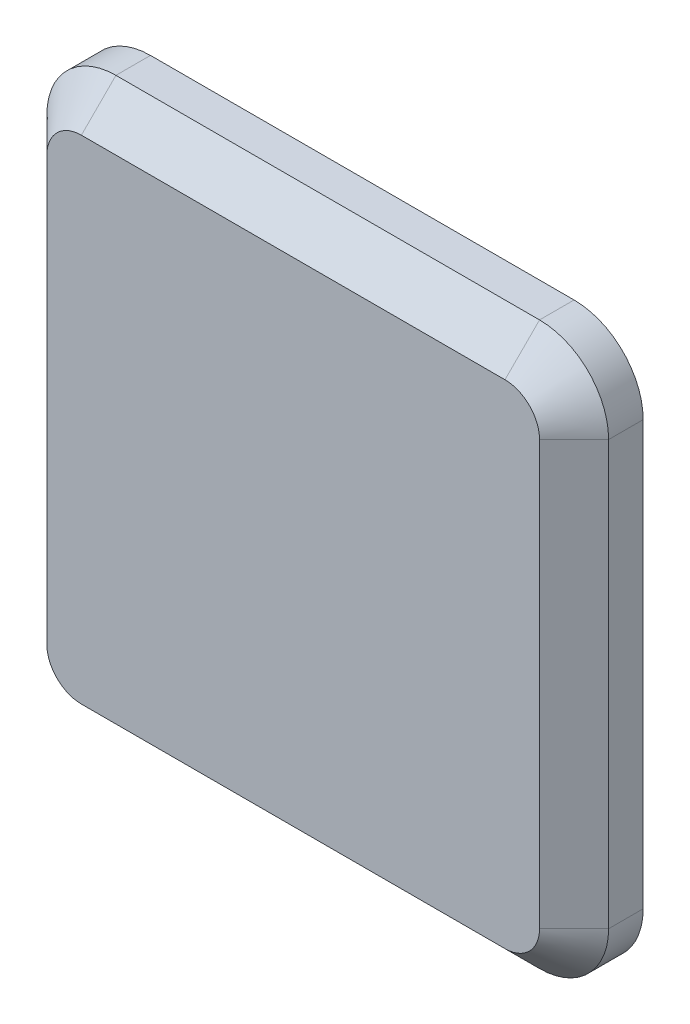
ISO-10303-21;
HEADER;
FILE_DESCRIPTION(('STEP AP214'),'2;1');
FILE_NAME('part.step','',(''),(''),'','','');
FILE_SCHEMA(('AUTOMOTIVE_DESIGN { 1 0 10303 214 1 1 1 1 }'));
ENDSEC;
DATA;
#1=APPLICATION_CONTEXT('core data for automotive mechanical design processes');
#2=APPLICATION_PROTOCOL_DEFINITION('international standard','automotive_design',2000,#1);
#3=PRODUCT_CONTEXT('',#1,'mechanical');
#4=PRODUCT('Part','Part','',(#3));
#5=PRODUCT_RELATED_PRODUCT_CATEGORY('part','',(#4));
#6=PRODUCT_DEFINITION_FORMATION('','',#4);
#7=PRODUCT_DEFINITION_CONTEXT('part definition',#1,'design');
#8=PRODUCT_DEFINITION('design','',#6,#7);
#9=PRODUCT_DEFINITION_SHAPE('','',#8);
#10=(LENGTH_UNIT() NAMED_UNIT(*) SI_UNIT(.MILLI.,.METRE.));
#11=(NAMED_UNIT(*) PLANE_ANGLE_UNIT() SI_UNIT($,.RADIAN.));
#12=(NAMED_UNIT(*) SI_UNIT($,.STERADIAN.) SOLID_ANGLE_UNIT());
#13=UNCERTAINTY_MEASURE_WITH_UNIT(LENGTH_MEASURE(1.E-05),#10,'distance_accuracy_value','');
#14=(GEOMETRIC_REPRESENTATION_CONTEXT(3) GLOBAL_UNCERTAINTY_ASSIGNED_CONTEXT((#13)) GLOBAL_UNIT_ASSIGNED_CONTEXT((#10,
#11,#12)) REPRESENTATION_CONTEXT('',''));
#15=CARTESIAN_POINT('',(0.,0.,0.));
#16=DIRECTION('',(0.,0.,1.));
#17=DIRECTION('',(1.,0.,0.));
#18=AXIS2_PLACEMENT_3D('',#15,#16,#17);
#19=CARTESIAN_POINT('',(-16.2634559672906,-16.2634559672906,4.));
#20=DIRECTION('',(1.,0.,0.));
#21=DIRECTION('',(0.,0.,-1.));
#22=AXIS2_PLACEMENT_3D('',#19,#20,#21);
#23=PLANE('',#22);
#24=DIRECTION('',(0.,0.,-1.));
#25=VECTOR('',#24,1.);
#26=CARTESIAN_POINT('',(-16.2634559672906,-12.2634559672906,4.));
#27=LINE('',#26,#25);
#28=CARTESIAN_POINT('',(-16.2634559672906,-12.2634559672906,0.));
#29=VERTEX_POINT('',#28);
#30=CARTESIAN_POINT('',(-16.2634559672906,-12.2634559672906,2.));
#31=VERTEX_POINT('',#30);
#32=EDGE_CURVE('E147',#29,#31,#27,.F.);
#33=ORIENTED_EDGE('',*,*,#32,.T.);
#34=DIRECTION('',(0.,1.,0.));
#35=VECTOR('',#34,1.);
#36=CARTESIAN_POINT('',(-16.2634559672906,12.2634559672906,2.));
#37=LINE('',#36,#35);
#38=CARTESIAN_POINT('',(-16.2634559672906,12.2634559672906,2.));
#39=VERTEX_POINT('',#38);
#40=EDGE_CURVE('E207',#31,#39,#37,.T.);
#41=ORIENTED_EDGE('',*,*,#40,.T.);
#42=DIRECTION('',(0.,0.,-1.));
#43=VECTOR('',#42,1.);
#44=CARTESIAN_POINT('',(-16.2634559672906,12.2634559672906,4.));
#45=LINE('',#44,#43);
#46=CARTESIAN_POINT('',(-16.2634559672906,12.2634559672906,0.));
#47=VERTEX_POINT('',#46);
#48=EDGE_CURVE('E151',#39,#47,#45,.T.);
#49=ORIENTED_EDGE('',*,*,#48,.T.);
#50=DIRECTION('',(0.,-1.,0.));
#51=VECTOR('',#50,1.);
#52=CARTESIAN_POINT('',(-16.2634559672906,-16.2634559672906,0.));
#53=LINE('',#52,#51);
#54=EDGE_CURVE('E158',#47,#29,#53,.T.);
#55=ORIENTED_EDGE('',*,*,#54,.T.);
#56=EDGE_LOOP('',(#33,#41,#49,#55));
#57=FACE_BOUND('',#56,.T.);
#58=ADVANCED_FACE('F39',(#57),#23,.F.);
#59=CARTESIAN_POINT('',(16.2634559672906,-16.2634559672906,4.));
#60=DIRECTION('',(0.,1.,0.));
#61=DIRECTION('',(-1.,0.,0.));
#62=AXIS2_PLACEMENT_3D('',#59,#60,#61);
#63=PLANE('',#62);
#64=DIRECTION('',(0.,0.,-1.));
#65=VECTOR('',#64,1.);
#66=CARTESIAN_POINT('',(12.2634559672906,-16.2634559672906,4.));
#67=LINE('',#66,#65);
#68=CARTESIAN_POINT('',(12.2634559672906,-16.2634559672906,0.));
#69=VERTEX_POINT('',#68);
#70=CARTESIAN_POINT('',(12.2634559672906,-16.2634559672906,2.));
#71=VERTEX_POINT('',#70);
#72=EDGE_CURVE('E141',#69,#71,#67,.F.);
#73=ORIENTED_EDGE('',*,*,#72,.T.);
#74=DIRECTION('',(-1.,0.,0.));
#75=VECTOR('',#74,1.);
#76=CARTESIAN_POINT('',(-12.2634559672906,-16.2634559672906,2.));
#77=LINE('',#76,#75);
#78=CARTESIAN_POINT('',(-12.2634559672906,-16.2634559672906,2.));
#79=VERTEX_POINT('',#78);
#80=EDGE_CURVE('E138',#71,#79,#77,.T.);
#81=ORIENTED_EDGE('',*,*,#80,.T.);
#82=DIRECTION('',(0.,0.,-1.));
#83=VECTOR('',#82,1.);
#84=CARTESIAN_POINT('',(-12.2634559672906,-16.2634559672906,4.));
#85=LINE('',#84,#83);
#86=CARTESIAN_POINT('',(-12.2634559672906,-16.2634559672906,0.));
#87=VERTEX_POINT('',#86);
#88=EDGE_CURVE('E130',#79,#87,#85,.T.);
#89=ORIENTED_EDGE('',*,*,#88,.T.);
#90=DIRECTION('',(1.,0.,0.));
#91=VECTOR('',#90,1.);
#92=CARTESIAN_POINT('',(16.2634559672906,-16.2634559672906,0.));
#93=LINE('',#92,#91);
#94=EDGE_CURVE('E135',#87,#69,#93,.T.);
#95=ORIENTED_EDGE('',*,*,#94,.T.);
#96=EDGE_LOOP('',(#73,#81,#89,#95));
#97=FACE_BOUND('',#96,.T.);
#98=ADVANCED_FACE('F133',(#97),#63,.F.);
#99=CARTESIAN_POINT('',(16.2634559672906,-16.2634559672906,4.));
#100=DIRECTION('',(-1.,0.,0.));
#101=DIRECTION('',(0.,0.,1.));
#102=AXIS2_PLACEMENT_3D('',#99,#100,#101);
#103=PLANE('',#102);
#104=DIRECTION('',(0.,0.,-1.));
#105=VECTOR('',#104,1.);
#106=CARTESIAN_POINT('',(16.2634559672906,12.2634559672906,4.));
#107=LINE('',#106,#105);
#108=CARTESIAN_POINT('',(16.2634559672906,12.2634559672906,0.));
#109=VERTEX_POINT('',#108);
#110=CARTESIAN_POINT('',(16.2634559672906,12.2634559672906,2.));
#111=VERTEX_POINT('',#110);
#112=EDGE_CURVE('E174',#109,#111,#107,.F.);
#113=ORIENTED_EDGE('',*,*,#112,.T.);
#114=DIRECTION('',(0.,-1.,0.));
#115=VECTOR('',#114,1.);
#116=CARTESIAN_POINT('',(16.2634559672906,-12.2634559672906,2.));
#117=LINE('',#116,#115);
#118=CARTESIAN_POINT('',(16.2634559672906,-12.2634559672906,2.));
#119=VERTEX_POINT('',#118);
#120=EDGE_CURVE('E205',#111,#119,#117,.T.);
#121=ORIENTED_EDGE('',*,*,#120,.T.);
#122=DIRECTION('',(0.,0.,-1.));
#123=VECTOR('',#122,1.);
#124=CARTESIAN_POINT('',(16.2634559672906,-12.2634559672906,4.));
#125=LINE('',#124,#123);
#126=CARTESIAN_POINT('',(16.2634559672906,-12.2634559672906,0.));
#127=VERTEX_POINT('',#126);
#128=EDGE_CURVE('E177',#119,#127,#125,.T.);
#129=ORIENTED_EDGE('',*,*,#128,.T.);
#130=DIRECTION('',(0.,1.,0.));
#131=VECTOR('',#130,1.);
#132=CARTESIAN_POINT('',(16.2634559672906,-16.2634559672906,0.));
#133=LINE('',#132,#131);
#134=EDGE_CURVE('E157',#127,#109,#133,.T.);
#135=ORIENTED_EDGE('',*,*,#134,.T.);
#136=EDGE_LOOP('',(#113,#121,#129,#135));
#137=FACE_BOUND('',#136,.T.);
#138=ADVANCED_FACE('F249',(#137),#103,.F.);
#139=CARTESIAN_POINT('',(16.2634559672906,16.2634559672906,4.));
#140=DIRECTION('',(0.,-1.,0.));
#141=DIRECTION('',(1.,0.,0.));
#142=AXIS2_PLACEMENT_3D('',#139,#140,#141);
#143=PLANE('',#142);
#144=DIRECTION('',(0.,0.,-1.));
#145=VECTOR('',#144,1.);
#146=CARTESIAN_POINT('',(-12.2634559672906,16.2634559672906,4.));
#147=LINE('',#146,#145);
#148=CARTESIAN_POINT('',(-12.2634559672906,16.2634559672906,0.));
#149=VERTEX_POINT('',#148);
#150=CARTESIAN_POINT('',(-12.2634559672906,16.2634559672906,2.));
#151=VERTEX_POINT('',#150);
#152=EDGE_CURVE('E179',#149,#151,#147,.F.);
#153=ORIENTED_EDGE('',*,*,#152,.T.);
#154=DIRECTION('',(1.,0.,0.));
#155=VECTOR('',#154,1.);
#156=CARTESIAN_POINT('',(12.2634559672906,16.2634559672906,2.));
#157=LINE('',#156,#155);
#158=CARTESIAN_POINT('',(12.2634559672906,16.2634559672906,2.));
#159=VERTEX_POINT('',#158);
#160=EDGE_CURVE('E11',#151,#159,#157,.T.);
#161=ORIENTED_EDGE('',*,*,#160,.T.);
#162=DIRECTION('',(0.,0.,-1.));
#163=VECTOR('',#162,1.);
#164=CARTESIAN_POINT('',(12.2634559672906,16.2634559672906,4.));
#165=LINE('',#164,#163);
#166=CARTESIAN_POINT('',(12.2634559672906,16.2634559672906,0.));
#167=VERTEX_POINT('',#166);
#168=EDGE_CURVE('E181',#159,#167,#165,.T.);
#169=ORIENTED_EDGE('',*,*,#168,.T.);
#170=DIRECTION('',(-1.,0.,0.));
#171=VECTOR('',#170,1.);
#172=CARTESIAN_POINT('',(16.2634559672906,16.2634559672906,0.));
#173=LINE('',#172,#171);
#174=EDGE_CURVE('E161',#167,#149,#173,.T.);
#175=ORIENTED_EDGE('',*,*,#174,.T.);
#176=EDGE_LOOP('',(#153,#161,#169,#175));
#177=FACE_BOUND('',#176,.T.);
#178=ADVANCED_FACE('F253',(#177),#143,.F.);
#179=CARTESIAN_POINT('',(0.,0.,4.));
#180=DIRECTION('',(0.,0.,1.));
#181=DIRECTION('',(1.,0.,0.));
#182=AXIS2_PLACEMENT_3D('',#179,#180,#181);
#183=PLANE('',#182);
#184=CARTESIAN_POINT('',(-12.2634559672906,-12.2634559672906,4.));
#185=DIRECTION('',(0.,0.,1.));
#186=DIRECTION('',(1.,0.,0.));
#187=AXIS2_PLACEMENT_3D('',#184,#185,#186);
#188=CIRCLE('',#187,2.00000000000001);
#189=CARTESIAN_POINT('',(-14.2634559672906,-12.2634559672906,4.));
#190=VERTEX_POINT('',#189);
#191=CARTESIAN_POINT('',(-12.2634559672906,-14.2634559672906,4.));
#192=VERTEX_POINT('',#191);
#193=EDGE_CURVE('E193',#190,#192,#188,.T.);
#194=ORIENTED_EDGE('',*,*,#193,.T.);
#195=DIRECTION('',(1.,0.,0.));
#196=VECTOR('',#195,1.);
#197=CARTESIAN_POINT('',(12.2634559672906,-14.2634559672906,4.));
#198=LINE('',#197,#196);
#199=CARTESIAN_POINT('',(12.2634559672906,-14.2634559672906,4.));
#200=VERTEX_POINT('',#199);
#201=EDGE_CURVE('E197',#192,#200,#198,.T.);
#202=ORIENTED_EDGE('',*,*,#201,.T.);
#203=CARTESIAN_POINT('',(12.2634559672906,-12.2634559672906,4.));
#204=DIRECTION('',(0.,0.,1.));
#205=DIRECTION('',(1.,0.,0.));
#206=AXIS2_PLACEMENT_3D('',#203,#204,#205);
#207=CIRCLE('',#206,2.00000000000001);
#208=CARTESIAN_POINT('',(14.2634559672906,-12.2634559672906,4.));
#209=VERTEX_POINT('',#208);
#210=EDGE_CURVE('E195',#200,#209,#207,.T.);
#211=ORIENTED_EDGE('',*,*,#210,.T.);
#212=DIRECTION('',(0.,1.,0.));
#213=VECTOR('',#212,1.);
#214=CARTESIAN_POINT('',(14.2634559672906,12.2634559672906,4.));
#215=LINE('',#214,#213);
#216=CARTESIAN_POINT('',(14.2634559672906,12.2634559672906,4.));
#217=VERTEX_POINT('',#216);
#218=EDGE_CURVE('E191',#209,#217,#215,.T.);
#219=ORIENTED_EDGE('',*,*,#218,.T.);
#220=CARTESIAN_POINT('',(12.2634559672906,12.2634559672906,4.));
#221=DIRECTION('',(0.,0.,1.));
#222=DIRECTION('',(1.,0.,0.));
#223=AXIS2_PLACEMENT_3D('',#220,#221,#222);
#224=CIRCLE('',#223,2.00000000000001);
#225=CARTESIAN_POINT('',(12.2634559672906,14.2634559672906,4.));
#226=VERTEX_POINT('',#225);
#227=EDGE_CURVE('E187',#217,#226,#224,.T.);
#228=ORIENTED_EDGE('',*,*,#227,.T.);
#229=DIRECTION('',(-1.,0.,0.));
#230=VECTOR('',#229,1.);
#231=CARTESIAN_POINT('',(-12.2634559672906,14.2634559672906,4.));
#232=LINE('',#231,#230);
#233=CARTESIAN_POINT('',(-12.2634559672906,14.2634559672906,4.));
#234=VERTEX_POINT('',#233);
#235=EDGE_CURVE('E183',#226,#234,#232,.T.);
#236=ORIENTED_EDGE('',*,*,#235,.T.);
#237=CARTESIAN_POINT('',(-12.2634559672906,12.2634559672906,4.));
#238=DIRECTION('',(0.,0.,1.));
#239=DIRECTION('',(1.,0.,0.));
#240=AXIS2_PLACEMENT_3D('',#237,#238,#239);
#241=CIRCLE('',#240,2.00000000000001);
#242=CARTESIAN_POINT('',(-14.2634559672906,12.2634559672906,4.));
#243=VERTEX_POINT('',#242);
#244=EDGE_CURVE('E185',#234,#243,#241,.T.);
#245=ORIENTED_EDGE('',*,*,#244,.T.);
#246=DIRECTION('',(0.,-1.,0.));
#247=VECTOR('',#246,1.);
#248=CARTESIAN_POINT('',(-14.2634559672906,-12.2634559672906,4.));
#249=LINE('',#248,#247);
#250=EDGE_CURVE('E189',#243,#190,#249,.T.);
#251=ORIENTED_EDGE('',*,*,#250,.T.);
#252=EDGE_LOOP('',(#194,#202,#211,#219,#228,#236,#245,#251));
#253=FACE_BOUND('',#252,.T.);
#254=ADVANCED_FACE('F268',(#253),#183,.T.);
#255=CARTESIAN_POINT('',(0.,0.,0.));
#256=DIRECTION('',(0.,0.,1.));
#257=DIRECTION('',(1.,0.,0.));
#258=AXIS2_PLACEMENT_3D('',#255,#256,#257);
#259=PLANE('',#258);
#260=ORIENTED_EDGE('',*,*,#94,.F.);
#261=CARTESIAN_POINT('',(-12.2634559672906,-12.2634559672906,0.));
#262=DIRECTION('',(0.,0.,1.));
#263=DIRECTION('',(1.,0.,0.));
#264=AXIS2_PLACEMENT_3D('',#261,#262,#263);
#265=CIRCLE('',#264,4.);
#266=EDGE_CURVE('E144',#87,#29,#265,.F.);
#267=ORIENTED_EDGE('',*,*,#266,.T.);
#268=ORIENTED_EDGE('',*,*,#54,.F.);
#269=CARTESIAN_POINT('',(-12.2634559672906,12.2634559672906,0.));
#270=DIRECTION('',(0.,0.,1.));
#271=DIRECTION('',(1.,0.,0.));
#272=AXIS2_PLACEMENT_3D('',#269,#270,#271);
#273=CIRCLE('',#272,4.);
#274=EDGE_CURVE('E140',#47,#149,#273,.F.);
#275=ORIENTED_EDGE('',*,*,#274,.T.);
#276=ORIENTED_EDGE('',*,*,#174,.F.);
#277=CARTESIAN_POINT('',(12.2634559672906,12.2634559672906,0.));
#278=DIRECTION('',(0.,0.,1.));
#279=DIRECTION('',(1.,0.,0.));
#280=AXIS2_PLACEMENT_3D('',#277,#278,#279);
#281=CIRCLE('',#280,4.);
#282=EDGE_CURVE('E169',#167,#109,#281,.F.);
#283=ORIENTED_EDGE('',*,*,#282,.T.);
#284=ORIENTED_EDGE('',*,*,#134,.F.);
#285=CARTESIAN_POINT('',(12.2634559672906,-12.2634559672906,0.));
#286=DIRECTION('',(0.,0.,1.));
#287=DIRECTION('',(1.,0.,0.));
#288=AXIS2_PLACEMENT_3D('',#285,#286,#287);
#289=CIRCLE('',#288,4.);
#290=EDGE_CURVE('E152',#127,#69,#289,.F.);
#291=ORIENTED_EDGE('',*,*,#290,.T.);
#292=EDGE_LOOP('',(#260,#267,#268,#275,#276,#283,#284,#291));
#293=FACE_BOUND('',#292,.T.);
#294=ADVANCED_FACE('F154',(#293),#259,.F.);
#295=CARTESIAN_POINT('',(-12.2634559672906,-12.2634559672906,4.));
#296=DIRECTION('',(0.,0.,-1.));
#297=DIRECTION('',(-1.,0.,0.));
#298=AXIS2_PLACEMENT_3D('',#295,#296,#297);
#299=CYLINDRICAL_SURFACE('',#298,4.);
#300=ORIENTED_EDGE('',*,*,#88,.F.);
#301=CARTESIAN_POINT('',(-12.2634559672906,-12.2634559672906,2.));
#302=DIRECTION('',(0.,0.,1.));
#303=DIRECTION('',(1.,0.,0.));
#304=AXIS2_PLACEMENT_3D('',#301,#302,#303);
#305=CIRCLE('',#304,4.);
#306=EDGE_CURVE('E203',#79,#31,#305,.F.);
#307=ORIENTED_EDGE('',*,*,#306,.T.);
#308=ORIENTED_EDGE('',*,*,#32,.F.);
#309=ORIENTED_EDGE('',*,*,#266,.F.);
#310=EDGE_LOOP('',(#300,#307,#308,#309));
#311=FACE_BOUND('',#310,.T.);
#312=ADVANCED_FACE('F145',(#311),#299,.T.);
#313=CARTESIAN_POINT('',(12.2634559672906,-12.2634559672906,4.));
#314=DIRECTION('',(0.,0.,-1.));
#315=DIRECTION('',(-1.,0.,0.));
#316=AXIS2_PLACEMENT_3D('',#313,#314,#315);
#317=CYLINDRICAL_SURFACE('',#316,4.);
#318=ORIENTED_EDGE('',*,*,#128,.F.);
#319=CARTESIAN_POINT('',(12.2634559672906,-12.2634559672906,2.));
#320=DIRECTION('',(0.,0.,1.));
#321=DIRECTION('',(1.,0.,0.));
#322=AXIS2_PLACEMENT_3D('',#319,#320,#321);
#323=CIRCLE('',#322,4.);
#324=EDGE_CURVE('E201',#119,#71,#323,.F.);
#325=ORIENTED_EDGE('',*,*,#324,.T.);
#326=ORIENTED_EDGE('',*,*,#72,.F.);
#327=ORIENTED_EDGE('',*,*,#290,.F.);
#328=EDGE_LOOP('',(#318,#325,#326,#327));
#329=FACE_BOUND('',#328,.T.);
#330=ADVANCED_FACE('F279',(#329),#317,.T.);
#331=CARTESIAN_POINT('',(12.2634559672906,12.2634559672906,4.));
#332=DIRECTION('',(0.,0.,-1.));
#333=DIRECTION('',(-1.,0.,0.));
#334=AXIS2_PLACEMENT_3D('',#331,#332,#333);
#335=CYLINDRICAL_SURFACE('',#334,4.);
#336=ORIENTED_EDGE('',*,*,#168,.F.);
#337=CARTESIAN_POINT('',(12.2634559672906,12.2634559672906,2.));
#338=DIRECTION('',(0.,0.,1.));
#339=DIRECTION('',(1.,0.,0.));
#340=AXIS2_PLACEMENT_3D('',#337,#338,#339);
#341=CIRCLE('',#340,4.);
#342=EDGE_CURVE('E209',#159,#111,#341,.F.);
#343=ORIENTED_EDGE('',*,*,#342,.T.);
#344=ORIENTED_EDGE('',*,*,#112,.F.);
#345=ORIENTED_EDGE('',*,*,#282,.F.);
#346=EDGE_LOOP('',(#336,#343,#344,#345));
#347=FACE_BOUND('',#346,.T.);
#348=ADVANCED_FACE('F246',(#347),#335,.T.);
#349=CARTESIAN_POINT('',(-12.2634559672906,12.2634559672906,4.));
#350=DIRECTION('',(0.,0.,-1.));
#351=DIRECTION('',(-1.,0.,0.));
#352=AXIS2_PLACEMENT_3D('',#349,#350,#351);
#353=CYLINDRICAL_SURFACE('',#352,4.);
#354=ORIENTED_EDGE('',*,*,#48,.F.);
#355=CARTESIAN_POINT('',(-12.2634559672906,12.2634559672906,2.));
#356=DIRECTION('',(0.,0.,1.));
#357=DIRECTION('',(1.,0.,0.));
#358=AXIS2_PLACEMENT_3D('',#355,#356,#357);
#359=CIRCLE('',#358,4.);
#360=EDGE_CURVE('E48',#39,#151,#359,.F.);
#361=ORIENTED_EDGE('',*,*,#360,.T.);
#362=ORIENTED_EDGE('',*,*,#152,.F.);
#363=ORIENTED_EDGE('',*,*,#274,.F.);
#364=EDGE_LOOP('',(#354,#361,#362,#363));
#365=FACE_BOUND('',#364,.T.);
#366=ADVANCED_FACE('F254',(#365),#353,.T.);
#367=CARTESIAN_POINT('',(0.,14.2634559672906,4.));
#368=DIRECTION('',(0.,0.70710678118655,0.707106781186545));
#369=DIRECTION('',(1.,0.,0.));
#370=AXIS2_PLACEMENT_3D('',#367,#368,#369);
#371=PLANE('',#370);
#372=DIRECTION('',(0.,-0.707106781186545,0.70710678118655));
#373=VECTOR('',#372,1.);
#374=CARTESIAN_POINT('',(12.2634559672906,16.2634559672906,2.));
#375=LINE('',#374,#373);
#376=EDGE_CURVE('E227',#159,#226,#375,.T.);
#377=ORIENTED_EDGE('',*,*,#376,.F.);
#378=ORIENTED_EDGE('',*,*,#160,.F.);
#379=DIRECTION('',(0.,0.707106781186545,-0.70710678118655));
#380=VECTOR('',#379,1.);
#381=CARTESIAN_POINT('',(-12.2634559672906,14.2634559672906,4.));
#382=LINE('',#381,#380);
#383=EDGE_CURVE('E43',#234,#151,#382,.T.);
#384=ORIENTED_EDGE('',*,*,#383,.F.);
#385=ORIENTED_EDGE('',*,*,#235,.F.);
#386=EDGE_LOOP('',(#377,#378,#384,#385));
#387=FACE_BOUND('',#386,.T.);
#388=ADVANCED_FACE('F41',(#387),#371,.T.);
#389=CARTESIAN_POINT('',(-12.2634559672906,12.2634559672906,4.));
#390=DIRECTION('',(0.,0.,-1.));
#391=DIRECTION('',(-1.,0.,0.));
#392=AXIS2_PLACEMENT_3D('',#389,#390,#391);
#393=CONICAL_SURFACE('',#392,2.00000000000001,0.785398163397445);
#394=ORIENTED_EDGE('',*,*,#383,.T.);
#395=ORIENTED_EDGE('',*,*,#360,.F.);
#396=DIRECTION('',(-0.707106781186545,0.,-0.70710678118655));
#397=VECTOR('',#396,1.);
#398=CARTESIAN_POINT('',(-14.2634559672906,12.2634559672906,4.));
#399=LINE('',#398,#397);
#400=EDGE_CURVE('E225',#243,#39,#399,.T.);
#401=ORIENTED_EDGE('',*,*,#400,.F.);
#402=ORIENTED_EDGE('',*,*,#244,.F.);
#403=EDGE_LOOP('',(#394,#395,#401,#402));
#404=FACE_BOUND('',#403,.T.);
#405=ADVANCED_FACE('F237',(#404),#393,.T.);
#406=CARTESIAN_POINT('',(12.2634559672906,12.2634559672906,4.));
#407=DIRECTION('',(0.,0.,-1.));
#408=DIRECTION('',(-1.,0.,0.));
#409=AXIS2_PLACEMENT_3D('',#406,#407,#408);
#410=CONICAL_SURFACE('',#409,2.00000000000001,0.785398163397445);
#411=ORIENTED_EDGE('',*,*,#376,.T.);
#412=ORIENTED_EDGE('',*,*,#227,.F.);
#413=DIRECTION('',(-0.707106781186545,0.,0.70710678118655));
#414=VECTOR('',#413,1.);
#415=CARTESIAN_POINT('',(16.2634559672906,12.2634559672906,2.));
#416=LINE('',#415,#414);
#417=EDGE_CURVE('E222',#111,#217,#416,.T.);
#418=ORIENTED_EDGE('',*,*,#417,.F.);
#419=ORIENTED_EDGE('',*,*,#342,.F.);
#420=EDGE_LOOP('',(#411,#412,#418,#419));
#421=FACE_BOUND('',#420,.T.);
#422=ADVANCED_FACE('F242',(#421),#410,.T.);
#423=CARTESIAN_POINT('',(-14.2634559672906,0.,4.));
#424=DIRECTION('',(-0.70710678118655,0.,0.707106781186545));
#425=DIRECTION('',(0.,1.,0.));
#426=AXIS2_PLACEMENT_3D('',#423,#424,#425);
#427=PLANE('',#426);
#428=ORIENTED_EDGE('',*,*,#400,.T.);
#429=ORIENTED_EDGE('',*,*,#40,.F.);
#430=DIRECTION('',(-0.707106781186545,0.,-0.70710678118655));
#431=VECTOR('',#430,1.);
#432=CARTESIAN_POINT('',(-14.2634559672906,-12.2634559672906,4.));
#433=LINE('',#432,#431);
#434=EDGE_CURVE('E219',#190,#31,#433,.T.);
#435=ORIENTED_EDGE('',*,*,#434,.F.);
#436=ORIENTED_EDGE('',*,*,#250,.F.);
#437=EDGE_LOOP('',(#428,#429,#435,#436));
#438=FACE_BOUND('',#437,.T.);
#439=ADVANCED_FACE('F259',(#438),#427,.T.);
#440=CARTESIAN_POINT('',(14.2634559672906,0.,4.));
#441=DIRECTION('',(0.70710678118655,0.,0.707106781186545));
#442=DIRECTION('',(0.,-1.,0.));
#443=AXIS2_PLACEMENT_3D('',#440,#441,#442);
#444=PLANE('',#443);
#445=ORIENTED_EDGE('',*,*,#417,.T.);
#446=ORIENTED_EDGE('',*,*,#218,.F.);
#447=DIRECTION('',(-0.707106781186545,0.,0.70710678118655));
#448=VECTOR('',#447,1.);
#449=CARTESIAN_POINT('',(16.2634559672906,-12.2634559672906,2.));
#450=LINE('',#449,#448);
#451=EDGE_CURVE('E216',#119,#209,#450,.T.);
#452=ORIENTED_EDGE('',*,*,#451,.F.);
#453=ORIENTED_EDGE('',*,*,#120,.F.);
#454=EDGE_LOOP('',(#445,#446,#452,#453));
#455=FACE_BOUND('',#454,.T.);
#456=ADVANCED_FACE('F271',(#455),#444,.T.);
#457=CARTESIAN_POINT('',(-12.2634559672906,-12.2634559672906,4.));
#458=DIRECTION('',(0.,0.,-1.));
#459=DIRECTION('',(-1.,0.,0.));
#460=AXIS2_PLACEMENT_3D('',#457,#458,#459);
#461=CONICAL_SURFACE('',#460,2.00000000000001,0.785398163397445);
#462=ORIENTED_EDGE('',*,*,#434,.T.);
#463=ORIENTED_EDGE('',*,*,#306,.F.);
#464=DIRECTION('',(0.,-0.707106781186545,-0.70710678118655));
#465=VECTOR('',#464,1.);
#466=CARTESIAN_POINT('',(-12.2634559672906,-14.2634559672906,4.));
#467=LINE('',#466,#465);
#468=EDGE_CURVE('E214',#192,#79,#467,.T.);
#469=ORIENTED_EDGE('',*,*,#468,.F.);
#470=ORIENTED_EDGE('',*,*,#193,.F.);
#471=EDGE_LOOP('',(#462,#463,#469,#470));
#472=FACE_BOUND('',#471,.T.);
#473=ADVANCED_FACE('F264',(#472),#461,.T.);
#474=CARTESIAN_POINT('',(12.2634559672906,-12.2634559672906,4.));
#475=DIRECTION('',(0.,0.,-1.));
#476=DIRECTION('',(-1.,0.,0.));
#477=AXIS2_PLACEMENT_3D('',#474,#475,#476);
#478=CONICAL_SURFACE('',#477,2.00000000000001,0.785398163397445);
#479=ORIENTED_EDGE('',*,*,#451,.T.);
#480=ORIENTED_EDGE('',*,*,#210,.F.);
#481=DIRECTION('',(0.,0.707106781186545,0.70710678118655));
#482=VECTOR('',#481,1.);
#483=CARTESIAN_POINT('',(12.2634559672906,-16.2634559672906,2.));
#484=LINE('',#483,#482);
#485=EDGE_CURVE('E212',#71,#200,#484,.T.);
#486=ORIENTED_EDGE('',*,*,#485,.F.);
#487=ORIENTED_EDGE('',*,*,#324,.F.);
#488=EDGE_LOOP('',(#479,#480,#486,#487));
#489=FACE_BOUND('',#488,.T.);
#490=ADVANCED_FACE('F277',(#489),#478,.T.);
#491=CARTESIAN_POINT('',(0.,-14.2634559672906,4.));
#492=DIRECTION('',(0.,-0.70710678118655,0.707106781186545));
#493=DIRECTION('',(-1.,0.,0.));
#494=AXIS2_PLACEMENT_3D('',#491,#492,#493);
#495=PLANE('',#494);
#496=ORIENTED_EDGE('',*,*,#468,.T.);
#497=ORIENTED_EDGE('',*,*,#80,.F.);
#498=ORIENTED_EDGE('',*,*,#485,.T.);
#499=ORIENTED_EDGE('',*,*,#201,.F.);
#500=EDGE_LOOP('',(#496,#497,#498,#499));
#501=FACE_BOUND('',#500,.T.);
#502=ADVANCED_FACE('F281',(#501),#495,.T.);
#503=CLOSED_SHELL('',(#58,#98,#138,#178,#254,#294,#312,#330,#348,#366,#388,#405,#422,#439,#456,
#473,#490,#502));
#504=MANIFOLD_SOLID_BREP('B2',#503);
#505=ADVANCED_BREP_SHAPE_REPRESENTATION('',(#18,#504),#14);
#506=SHAPE_DEFINITION_REPRESENTATION(#9,#505);
ENDSEC;
END-ISO-10303-21;
